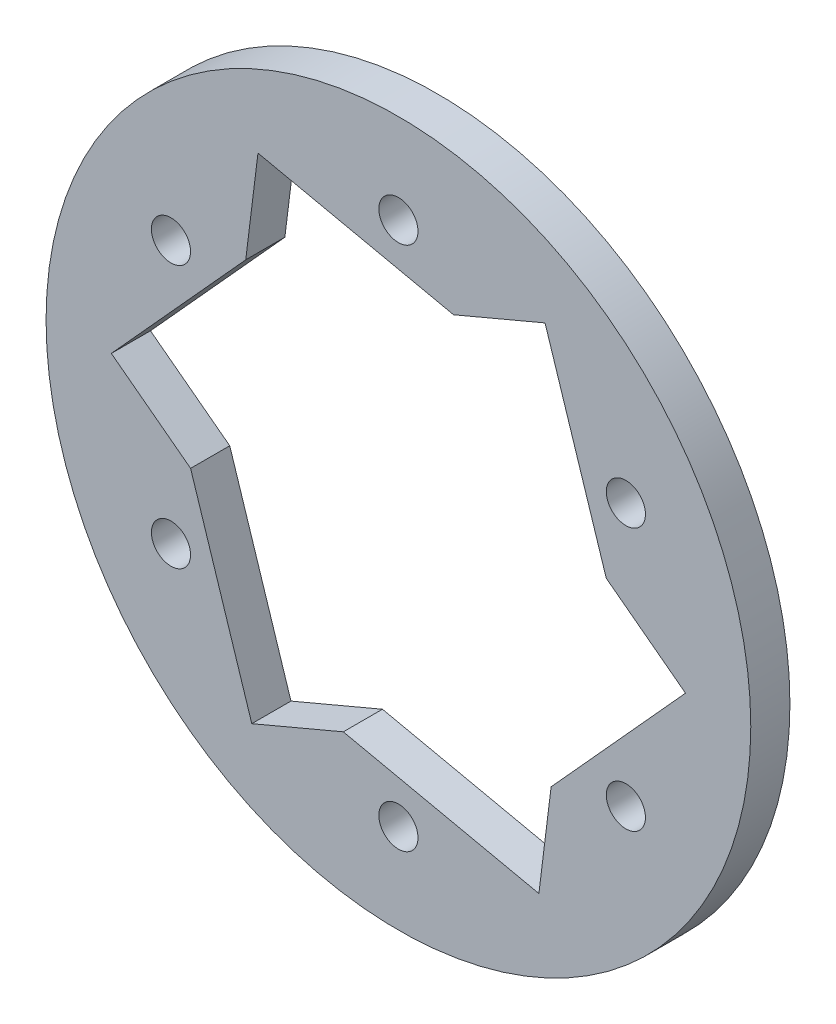
ISO-10303-21;
HEADER;
FILE_DESCRIPTION(('STEP AP214'),'2;1');
FILE_NAME('part.step','',(''),(''),'','','');
FILE_SCHEMA(('AUTOMOTIVE_DESIGN { 1 0 10303 214 1 1 1 1 }'));
ENDSEC;
DATA;
#1=APPLICATION_CONTEXT('core data for automotive mechanical design processes');
#2=APPLICATION_PROTOCOL_DEFINITION('international standard','automotive_design',2000,#1);
#3=PRODUCT_CONTEXT('',#1,'mechanical');
#4=PRODUCT('Part','Part','',(#3));
#5=PRODUCT_RELATED_PRODUCT_CATEGORY('part','',(#4));
#6=PRODUCT_DEFINITION_FORMATION('','',#4);
#7=PRODUCT_DEFINITION_CONTEXT('part definition',#1,'design');
#8=PRODUCT_DEFINITION('design','',#6,#7);
#9=PRODUCT_DEFINITION_SHAPE('','',#8);
#10=(LENGTH_UNIT() NAMED_UNIT(*) SI_UNIT(.MILLI.,.METRE.));
#11=(NAMED_UNIT(*) PLANE_ANGLE_UNIT() SI_UNIT($,.RADIAN.));
#12=(NAMED_UNIT(*) SI_UNIT($,.STERADIAN.) SOLID_ANGLE_UNIT());
#13=UNCERTAINTY_MEASURE_WITH_UNIT(LENGTH_MEASURE(1.E-05),#10,'distance_accuracy_value','');
#14=(GEOMETRIC_REPRESENTATION_CONTEXT(3) GLOBAL_UNCERTAINTY_ASSIGNED_CONTEXT((#13)) GLOBAL_UNIT_ASSIGNED_CONTEXT((#10,
#11,#12)) REPRESENTATION_CONTEXT('',''));
#15=CARTESIAN_POINT('',(0.,0.,0.));
#16=DIRECTION('',(0.,0.,1.));
#17=DIRECTION('',(1.,0.,0.));
#18=AXIS2_PLACEMENT_3D('',#15,#16,#17);
#19=CARTESIAN_POINT('',(158.4272777439,241.9520199932,3.));
#20=DIRECTION('',(0.,0.,1.));
#21=DIRECTION('',(1.,0.,0.));
#22=AXIS2_PLACEMENT_3D('',#19,#20,#21);
#23=PLANE('',#22);
#24=CARTESIAN_POINT('',(175.8557028019,252.014325892,3.));
#25=DIRECTION('',(0.,0.,1.));
#26=DIRECTION('',(1.,0.,0.));
#27=AXIS2_PLACEMENT_3D('',#24,#25,#26);
#28=CIRCLE('',#27,1.5);
#29=CARTESIAN_POINT('',(177.3557028019,252.014325892,3.));
#30=VERTEX_POINT('',#29);
#31=EDGE_CURVE('E215',#30,#30,#28,.T.);
#32=ORIENTED_EDGE('',*,*,#31,.F.);
#33=EDGE_LOOP('',(#32));
#34=FACE_BOUND('',#33,.T.);
#35=CARTESIAN_POINT('',(158.4272777439,221.8274081957,3.));
#36=DIRECTION('',(0.,0.,1.));
#37=DIRECTION('',(1.,0.,0.));
#38=AXIS2_PLACEMENT_3D('',#35,#36,#37);
#39=CIRCLE('',#38,1.5);
#40=CARTESIAN_POINT('',(159.9272777439,221.8274081957,3.));
#41=VERTEX_POINT('',#40);
#42=EDGE_CURVE('E227',#41,#41,#39,.T.);
#43=ORIENTED_EDGE('',*,*,#42,.F.);
#44=EDGE_LOOP('',(#43));
#45=FACE_BOUND('',#44,.T.);
#46=CARTESIAN_POINT('',(140.998852686,252.014325892,3.));
#47=DIRECTION('',(0.,0.,1.));
#48=DIRECTION('',(1.,0.,0.));
#49=AXIS2_PLACEMENT_3D('',#46,#47,#48);
#50=CIRCLE('',#49,1.5);
#51=CARTESIAN_POINT('',(142.498852686,252.014325892,3.));
#52=VERTEX_POINT('',#51);
#53=EDGE_CURVE('E239',#52,#52,#50,.T.);
#54=ORIENTED_EDGE('',*,*,#53,.F.);
#55=EDGE_LOOP('',(#54));
#56=FACE_BOUND('',#55,.T.);
#57=CARTESIAN_POINT('',(158.4272777439,241.9520199932,3.));
#58=DIRECTION('',(0.,0.,1.));
#59=DIRECTION('',(1.,0.,0.));
#60=AXIS2_PLACEMENT_3D('',#57,#58,#59);
#61=CIRCLE('',#60,27.);
#62=CARTESIAN_POINT('',(185.4272777439,241.9520199932,3.));
#63=VERTEX_POINT('',#62);
#64=EDGE_CURVE('E11',#63,#63,#61,.T.);
#65=ORIENTED_EDGE('',*,*,#64,.T.);
#66=EDGE_LOOP('',(#65));
#67=FACE_BOUND('',#66,.T.);
#68=CARTESIAN_POINT('',(158.4272777439,262.0766317907,3.));
#69=DIRECTION('',(0.,0.,1.));
#70=DIRECTION('',(1.,0.,0.));
#71=AXIS2_PLACEMENT_3D('',#68,#69,#70);
#72=CIRCLE('',#71,1.5);
#73=CARTESIAN_POINT('',(159.9272777439,262.0766317907,3.));
#74=VERTEX_POINT('',#73);
#75=EDGE_CURVE('E245',#74,#74,#72,.T.);
#76=ORIENTED_EDGE('',*,*,#75,.F.);
#77=EDGE_LOOP('',(#76));
#78=FACE_BOUND('',#77,.T.);
#79=CARTESIAN_POINT('',(140.998852686,231.8897140945,3.));
#80=DIRECTION('',(0.,0.,1.));
#81=DIRECTION('',(1.,0.,0.));
#82=AXIS2_PLACEMENT_3D('',#79,#80,#81);
#83=CIRCLE('',#82,1.5);
#84=CARTESIAN_POINT('',(142.498852686,231.8897140945,3.));
#85=VERTEX_POINT('',#84);
#86=EDGE_CURVE('E233',#85,#85,#83,.T.);
#87=ORIENTED_EDGE('',*,*,#86,.F.);
#88=EDGE_LOOP('',(#87));
#89=FACE_BOUND('',#88,.T.);
#90=CARTESIAN_POINT('',(175.8557028019,231.8897140945,3.));
#91=DIRECTION('',(0.,0.,1.));
#92=DIRECTION('',(1.,0.,0.));
#93=AXIS2_PLACEMENT_3D('',#90,#91,#92);
#94=CIRCLE('',#93,1.5);
#95=CARTESIAN_POINT('',(177.3557028019,231.8897140945,3.));
#96=VERTEX_POINT('',#95);
#97=EDGE_CURVE('E221',#96,#96,#94,.T.);
#98=ORIENTED_EDGE('',*,*,#97,.F.);
#99=EDGE_LOOP('',(#98));
#100=FACE_BOUND('',#99,.T.);
#101=DIRECTION('',(-0.921034791666512,-0.389480310850017,0.));
#102=VECTOR('',#101,1.);
#103=CARTESIAN_POINT('',(162.6518619415,257.9020321675,3.));
#104=LINE('',#103,#102);
#105=CARTESIAN_POINT('',(169.6626817403,260.8667152601,3.));
#106=VERTEX_POINT('',#105);
#107=CARTESIAN_POINT('',(162.6518619415,257.9020321675,3.));
#108=VERTEX_POINT('',#107);
#109=EDGE_CURVE('E130',#106,#108,#104,.T.);
#110=ORIENTED_EDGE('',*,*,#109,.F.);
#111=DIRECTION('',(-0.305873073601218,0.952072299169419,0.));
#112=VECTOR('',#111,1.);
#113=CARTESIAN_POINT('',(174.3526855762,246.2684288448,3.));
#114=LINE('',#113,#112);
#115=CARTESIAN_POINT('',(174.3526855762,246.2684288448,3.));
#116=VERTEX_POINT('',#115);
#117=EDGE_CURVE('E122',#116,#106,#114,.T.);
#118=ORIENTED_EDGE('',*,*,#117,.F.);
#119=DIRECTION('',(-0.797817239310822,0.602899371917453,0.));
#120=VECTOR('',#119,1.);
#121=CARTESIAN_POINT('',(174.3526855762,246.2684288448,3.));
#122=LINE('',#121,#120);
#123=CARTESIAN_POINT('',(180.4255863481,241.679222344,3.));
#124=VERTEX_POINT('',#123);
#125=EDGE_CURVE('E163',#124,#116,#122,.T.);
#126=ORIENTED_EDGE('',*,*,#125,.F.);
#127=DIRECTION('',(0.671582260518353,0.740930001658091,0.));
#128=VECTOR('',#127,1.);
#129=CARTESIAN_POINT('',(170.1281013787,230.3184166706,3.));
#130=LINE('',#129,#128);
#131=CARTESIAN_POINT('',(170.1281013787,230.3184166706,3.));
#132=VERTEX_POINT('',#131);
#133=EDGE_CURVE('E161',#132,#124,#130,.T.);
#134=ORIENTED_EDGE('',*,*,#133,.F.);
#135=DIRECTION('',(0.123217552356987,0.992379682778297,0.));
#136=VECTOR('',#135,1.);
#137=CARTESIAN_POINT('',(170.1281013787,230.3184166706,3.));
#138=LINE('',#137,#136);
#139=CARTESIAN_POINT('',(169.1901823517,222.7645270771,3.));
#140=VERTEX_POINT('',#139);
#141=EDGE_CURVE('E159',#140,#132,#138,.T.);
#142=ORIENTED_EDGE('',*,*,#141,.F.);
#143=DIRECTION('',(0.977455334120913,-0.211142297511831,0.));
#144=VECTOR('',#143,1.);
#145=CARTESIAN_POINT('',(154.2026935464,226.002007819,3.));
#146=LINE('',#145,#144);
#147=CARTESIAN_POINT('',(154.2026935464,226.002007819,3.));
#148=VERTEX_POINT('',#147);
#149=EDGE_CURVE('E157',#148,#140,#146,.T.);
#150=ORIENTED_EDGE('',*,*,#149,.F.);
#151=DIRECTION('',(0.921034791668505,0.389480310845304,0.));
#152=VECTOR('',#151,1.);
#153=CARTESIAN_POINT('',(154.2026935464,226.002007819,3.));
#154=LINE('',#153,#152);
#155=CARTESIAN_POINT('',(147.1918737475,223.0373247264,3.));
#156=VERTEX_POINT('',#155);
#157=EDGE_CURVE('E155',#156,#148,#154,.T.);
#158=ORIENTED_EDGE('',*,*,#157,.F.);
#159=DIRECTION('',(0.305873073603116,-0.952072299168809,0.));
#160=VECTOR('',#159,1.);
#161=CARTESIAN_POINT('',(142.5018699116,237.6356111416,3.));
#162=LINE('',#161,#160);
#163=CARTESIAN_POINT('',(142.5018699116,237.6356111416,3.));
#164=VERTEX_POINT('',#163);
#165=EDGE_CURVE('E153',#164,#156,#162,.T.);
#166=ORIENTED_EDGE('',*,*,#165,.F.);
#167=DIRECTION('',(0.797817239305675,-0.602899371924263,0.));
#168=VECTOR('',#167,1.);
#169=CARTESIAN_POINT('',(142.5018699116,237.6356111416,3.));
#170=LINE('',#169,#168);
#171=CARTESIAN_POINT('',(136.4272816388,242.2260928634,3.));
#172=VERTEX_POINT('',#171);
#173=EDGE_CURVE('E151',#172,#164,#170,.T.);
#174=ORIENTED_EDGE('',*,*,#173,.F.);
#175=DIRECTION('',(-0.671684054693982,-0.740837722223869,0.));
#176=VECTOR('',#175,1.);
#177=CARTESIAN_POINT('',(146.7264541091,253.5856233158,3.));
#178=LINE('',#177,#176);
#179=CARTESIAN_POINT('',(146.7264541091,253.5856233158,3.));
#180=VERTEX_POINT('',#179);
#181=EDGE_CURVE('E149',#180,#172,#178,.T.);
#182=ORIENTED_EDGE('',*,*,#181,.F.);
#183=DIRECTION('',(-0.123217552369929,-0.99237968277669,0.));
#184=VECTOR('',#183,1.);
#185=CARTESIAN_POINT('',(146.7264541091,253.5856233158,3.));
#186=LINE('',#185,#184);
#187=CARTESIAN_POINT('',(147.6643731362,261.1395129093,3.));
#188=VERTEX_POINT('',#187);
#189=EDGE_CURVE('E145',#188,#180,#186,.T.);
#190=ORIENTED_EDGE('',*,*,#189,.F.);
#191=DIRECTION('',(-0.977455334122259,0.211142297505598,0.));
#192=VECTOR('',#191,1.);
#193=CARTESIAN_POINT('',(162.6518619415,257.9020321675,3.));
#194=LINE('',#193,#192);
#195=EDGE_CURVE('E143',#108,#188,#194,.T.);
#196=ORIENTED_EDGE('',*,*,#195,.F.);
#197=EDGE_LOOP('',(#110,#118,#126,#134,#142,#150,#158,#166,#174,#182,#190,#196));
#198=FACE_BOUND('',#197,.T.);
#199=ADVANCED_FACE('F33',(#34,#45,#56,#67,#78,#89,#100,#198),#23,.T.);
#200=CARTESIAN_POINT('',(158.4272777439,241.9520199932,0.));
#201=DIRECTION('',(0.,0.,1.));
#202=DIRECTION('',(1.,0.,0.));
#203=AXIS2_PLACEMENT_3D('',#200,#201,#202);
#204=PLANE('',#203);
#205=CARTESIAN_POINT('',(175.8557028019,252.014325892,0.));
#206=DIRECTION('',(0.,0.,1.));
#207=DIRECTION('',(1.,0.,0.));
#208=AXIS2_PLACEMENT_3D('',#205,#206,#207);
#209=CIRCLE('',#208,1.5);
#210=CARTESIAN_POINT('',(177.3557028019,252.014325892,0.));
#211=VERTEX_POINT('',#210);
#212=EDGE_CURVE('E138',#211,#211,#209,.T.);
#213=ORIENTED_EDGE('',*,*,#212,.T.);
#214=EDGE_LOOP('',(#213));
#215=FACE_BOUND('',#214,.T.);
#216=CARTESIAN_POINT('',(158.4272777439,221.8274081957,0.));
#217=DIRECTION('',(0.,0.,1.));
#218=DIRECTION('',(1.,0.,0.));
#219=AXIS2_PLACEMENT_3D('',#216,#217,#218);
#220=CIRCLE('',#219,1.5);
#221=CARTESIAN_POINT('',(159.9272777439,221.8274081957,0.));
#222=VERTEX_POINT('',#221);
#223=EDGE_CURVE('E224',#222,#222,#220,.T.);
#224=ORIENTED_EDGE('',*,*,#223,.T.);
#225=EDGE_LOOP('',(#224));
#226=FACE_BOUND('',#225,.T.);
#227=CARTESIAN_POINT('',(140.998852686,252.014325892,0.));
#228=DIRECTION('',(0.,0.,1.));
#229=DIRECTION('',(1.,0.,0.));
#230=AXIS2_PLACEMENT_3D('',#227,#228,#229);
#231=CIRCLE('',#230,1.5);
#232=CARTESIAN_POINT('',(142.498852686,252.014325892,0.));
#233=VERTEX_POINT('',#232);
#234=EDGE_CURVE('E236',#233,#233,#231,.T.);
#235=ORIENTED_EDGE('',*,*,#234,.T.);
#236=EDGE_LOOP('',(#235));
#237=FACE_BOUND('',#236,.T.);
#238=CARTESIAN_POINT('',(158.4272777439,241.9520199932,0.));
#239=DIRECTION('',(0.,0.,1.));
#240=DIRECTION('',(1.,0.,0.));
#241=AXIS2_PLACEMENT_3D('',#238,#239,#240);
#242=CIRCLE('',#241,27.);
#243=CARTESIAN_POINT('',(185.4272777439,241.9520199932,0.));
#244=VERTEX_POINT('',#243);
#245=EDGE_CURVE('E37',#244,#244,#242,.T.);
#246=ORIENTED_EDGE('',*,*,#245,.F.);
#247=EDGE_LOOP('',(#246));
#248=FACE_BOUND('',#247,.T.);
#249=CARTESIAN_POINT('',(158.4272777439,262.0766317907,0.));
#250=DIRECTION('',(0.,0.,1.));
#251=DIRECTION('',(1.,0.,0.));
#252=AXIS2_PLACEMENT_3D('',#249,#250,#251);
#253=CIRCLE('',#252,1.5);
#254=CARTESIAN_POINT('',(159.9272777439,262.0766317907,0.));
#255=VERTEX_POINT('',#254);
#256=EDGE_CURVE('E242',#255,#255,#253,.T.);
#257=ORIENTED_EDGE('',*,*,#256,.T.);
#258=EDGE_LOOP('',(#257));
#259=FACE_BOUND('',#258,.T.);
#260=CARTESIAN_POINT('',(140.998852686,231.8897140945,0.));
#261=DIRECTION('',(0.,0.,1.));
#262=DIRECTION('',(1.,0.,0.));
#263=AXIS2_PLACEMENT_3D('',#260,#261,#262);
#264=CIRCLE('',#263,1.5);
#265=CARTESIAN_POINT('',(142.498852686,231.8897140945,0.));
#266=VERTEX_POINT('',#265);
#267=EDGE_CURVE('E230',#266,#266,#264,.T.);
#268=ORIENTED_EDGE('',*,*,#267,.T.);
#269=EDGE_LOOP('',(#268));
#270=FACE_BOUND('',#269,.T.);
#271=CARTESIAN_POINT('',(175.8557028019,231.8897140945,0.));
#272=DIRECTION('',(0.,0.,1.));
#273=DIRECTION('',(1.,0.,0.));
#274=AXIS2_PLACEMENT_3D('',#271,#272,#273);
#275=CIRCLE('',#274,1.5);
#276=CARTESIAN_POINT('',(177.3557028019,231.8897140945,0.));
#277=VERTEX_POINT('',#276);
#278=EDGE_CURVE('E218',#277,#277,#275,.T.);
#279=ORIENTED_EDGE('',*,*,#278,.T.);
#280=EDGE_LOOP('',(#279));
#281=FACE_BOUND('',#280,.T.);
#282=DIRECTION('',(-0.305873073601218,0.952072299169419,0.));
#283=VECTOR('',#282,1.);
#284=CARTESIAN_POINT('',(174.3526855762,246.2684288448,0.));
#285=LINE('',#284,#283);
#286=CARTESIAN_POINT('',(174.3526855762,246.2684288448,0.));
#287=VERTEX_POINT('',#286);
#288=CARTESIAN_POINT('',(169.6626817403,260.8667152601,0.));
#289=VERTEX_POINT('',#288);
#290=EDGE_CURVE('E56',#287,#289,#285,.T.);
#291=ORIENTED_EDGE('',*,*,#290,.T.);
#292=DIRECTION('',(-0.921034791666512,-0.389480310850017,0.));
#293=VECTOR('',#292,1.);
#294=CARTESIAN_POINT('',(162.6518619415,257.9020321675,0.));
#295=LINE('',#294,#293);
#296=CARTESIAN_POINT('',(162.6518619415,257.9020321675,0.));
#297=VERTEX_POINT('',#296);
#298=EDGE_CURVE('E137',#289,#297,#295,.T.);
#299=ORIENTED_EDGE('',*,*,#298,.T.);
#300=DIRECTION('',(-0.977455334122259,0.211142297505598,0.));
#301=VECTOR('',#300,1.);
#302=CARTESIAN_POINT('',(162.6518619415,257.9020321675,0.));
#303=LINE('',#302,#301);
#304=CARTESIAN_POINT('',(147.6643731362,261.1395129093,0.));
#305=VERTEX_POINT('',#304);
#306=EDGE_CURVE('E167',#297,#305,#303,.T.);
#307=ORIENTED_EDGE('',*,*,#306,.T.);
#308=DIRECTION('',(-0.123217552369929,-0.99237968277669,0.));
#309=VECTOR('',#308,1.);
#310=CARTESIAN_POINT('',(146.7264541091,253.5856233158,0.));
#311=LINE('',#310,#309);
#312=CARTESIAN_POINT('',(146.7264541091,253.5856233158,0.));
#313=VERTEX_POINT('',#312);
#314=EDGE_CURVE('E170',#305,#313,#311,.T.);
#315=ORIENTED_EDGE('',*,*,#314,.T.);
#316=DIRECTION('',(-0.671684054693982,-0.740837722223869,0.));
#317=VECTOR('',#316,1.);
#318=CARTESIAN_POINT('',(146.7264541091,253.5856233158,0.));
#319=LINE('',#318,#317);
#320=CARTESIAN_POINT('',(136.4272816388,242.2260928634,0.));
#321=VERTEX_POINT('',#320);
#322=EDGE_CURVE('E173',#313,#321,#319,.T.);
#323=ORIENTED_EDGE('',*,*,#322,.T.);
#324=DIRECTION('',(0.797817239305675,-0.602899371924263,0.));
#325=VECTOR('',#324,1.);
#326=CARTESIAN_POINT('',(142.5018699116,237.6356111416,0.));
#327=LINE('',#326,#325);
#328=CARTESIAN_POINT('',(142.5018699116,237.6356111416,0.));
#329=VERTEX_POINT('',#328);
#330=EDGE_CURVE('E176',#321,#329,#327,.T.);
#331=ORIENTED_EDGE('',*,*,#330,.T.);
#332=DIRECTION('',(0.305873073603116,-0.952072299168809,0.));
#333=VECTOR('',#332,1.);
#334=CARTESIAN_POINT('',(142.5018699116,237.6356111416,0.));
#335=LINE('',#334,#333);
#336=CARTESIAN_POINT('',(147.1918737475,223.0373247264,0.));
#337=VERTEX_POINT('',#336);
#338=EDGE_CURVE('E179',#329,#337,#335,.T.);
#339=ORIENTED_EDGE('',*,*,#338,.T.);
#340=DIRECTION('',(0.921034791668505,0.389480310845304,0.));
#341=VECTOR('',#340,1.);
#342=CARTESIAN_POINT('',(154.2026935464,226.002007819,0.));
#343=LINE('',#342,#341);
#344=CARTESIAN_POINT('',(154.2026935464,226.002007819,0.));
#345=VERTEX_POINT('',#344);
#346=EDGE_CURVE('E182',#337,#345,#343,.T.);
#347=ORIENTED_EDGE('',*,*,#346,.T.);
#348=DIRECTION('',(0.977455334120913,-0.211142297511831,0.));
#349=VECTOR('',#348,1.);
#350=CARTESIAN_POINT('',(154.2026935464,226.002007819,0.));
#351=LINE('',#350,#349);
#352=CARTESIAN_POINT('',(169.1901823517,222.7645270771,0.));
#353=VERTEX_POINT('',#352);
#354=EDGE_CURVE('E185',#345,#353,#351,.T.);
#355=ORIENTED_EDGE('',*,*,#354,.T.);
#356=DIRECTION('',(0.123217552356987,0.992379682778297,0.));
#357=VECTOR('',#356,1.);
#358=CARTESIAN_POINT('',(170.1281013787,230.3184166706,0.));
#359=LINE('',#358,#357);
#360=CARTESIAN_POINT('',(170.1281013787,230.3184166706,0.));
#361=VERTEX_POINT('',#360);
#362=EDGE_CURVE('E188',#353,#361,#359,.T.);
#363=ORIENTED_EDGE('',*,*,#362,.T.);
#364=DIRECTION('',(0.671582260518353,0.740930001658091,0.));
#365=VECTOR('',#364,1.);
#366=CARTESIAN_POINT('',(170.1281013787,230.3184166706,0.));
#367=LINE('',#366,#365);
#368=CARTESIAN_POINT('',(180.4255863481,241.679222344,0.));
#369=VERTEX_POINT('',#368);
#370=EDGE_CURVE('E191',#361,#369,#367,.T.);
#371=ORIENTED_EDGE('',*,*,#370,.T.);
#372=DIRECTION('',(-0.797817239310822,0.602899371917453,0.));
#373=VECTOR('',#372,1.);
#374=CARTESIAN_POINT('',(174.3526855762,246.2684288448,0.));
#375=LINE('',#374,#373);
#376=EDGE_CURVE('E131',#369,#287,#375,.T.);
#377=ORIENTED_EDGE('',*,*,#376,.T.);
#378=EDGE_LOOP('',(#291,#299,#307,#315,#323,#331,#339,#347,#355,#363,#371,#377));
#379=FACE_BOUND('',#378,.T.);
#380=ADVANCED_FACE('F251',(#215,#226,#237,#248,#259,#270,#281,#379),#204,.F.);
#381=CARTESIAN_POINT('',(158.4272777439,241.9520199932,3.));
#382=DIRECTION('',(0.,0.,-1.));
#383=DIRECTION('',(-1.,0.,0.));
#384=AXIS2_PLACEMENT_3D('',#381,#382,#383);
#385=CYLINDRICAL_SURFACE('',#384,27.);
#386=ORIENTED_EDGE('',*,*,#64,.F.);
#387=EDGE_LOOP('',(#386));
#388=FACE_BOUND('',#387,.T.);
#389=ORIENTED_EDGE('',*,*,#245,.T.);
#390=EDGE_LOOP('',(#389));
#391=FACE_BOUND('',#390,.T.);
#392=ADVANCED_FACE('F35',(#388,#391),#385,.T.);
#393=CARTESIAN_POINT('',(158.4272777439,262.0766317907,3.));
#394=DIRECTION('',(0.,0.,-1.));
#395=DIRECTION('',(-1.,0.,0.));
#396=AXIS2_PLACEMENT_3D('',#393,#394,#395);
#397=CYLINDRICAL_SURFACE('',#396,1.5);
#398=ORIENTED_EDGE('',*,*,#75,.T.);
#399=EDGE_LOOP('',(#398));
#400=FACE_BOUND('',#399,.T.);
#401=ORIENTED_EDGE('',*,*,#256,.F.);
#402=EDGE_LOOP('',(#401));
#403=FACE_BOUND('',#402,.T.);
#404=ADVANCED_FACE('F254',(#400,#403),#397,.F.);
#405=CARTESIAN_POINT('',(140.998852686,252.014325892,3.));
#406=DIRECTION('',(0.,0.,-1.));
#407=DIRECTION('',(-1.,0.,0.));
#408=AXIS2_PLACEMENT_3D('',#405,#406,#407);
#409=CYLINDRICAL_SURFACE('',#408,1.5);
#410=ORIENTED_EDGE('',*,*,#53,.T.);
#411=EDGE_LOOP('',(#410));
#412=FACE_BOUND('',#411,.T.);
#413=ORIENTED_EDGE('',*,*,#234,.F.);
#414=EDGE_LOOP('',(#413));
#415=FACE_BOUND('',#414,.T.);
#416=ADVANCED_FACE('F256',(#412,#415),#409,.F.);
#417=CARTESIAN_POINT('',(140.998852686,231.8897140945,3.));
#418=DIRECTION('',(0.,0.,-1.));
#419=DIRECTION('',(-1.,0.,0.));
#420=AXIS2_PLACEMENT_3D('',#417,#418,#419);
#421=CYLINDRICAL_SURFACE('',#420,1.5);
#422=ORIENTED_EDGE('',*,*,#86,.T.);
#423=EDGE_LOOP('',(#422));
#424=FACE_BOUND('',#423,.T.);
#425=ORIENTED_EDGE('',*,*,#267,.F.);
#426=EDGE_LOOP('',(#425));
#427=FACE_BOUND('',#426,.T.);
#428=ADVANCED_FACE('F263',(#424,#427),#421,.F.);
#429=CARTESIAN_POINT('',(158.4272777439,221.8274081957,3.));
#430=DIRECTION('',(0.,0.,-1.));
#431=DIRECTION('',(-1.,0.,0.));
#432=AXIS2_PLACEMENT_3D('',#429,#430,#431);
#433=CYLINDRICAL_SURFACE('',#432,1.5);
#434=ORIENTED_EDGE('',*,*,#42,.T.);
#435=EDGE_LOOP('',(#434));
#436=FACE_BOUND('',#435,.T.);
#437=ORIENTED_EDGE('',*,*,#223,.F.);
#438=EDGE_LOOP('',(#437));
#439=FACE_BOUND('',#438,.T.);
#440=ADVANCED_FACE('F292',(#436,#439),#433,.F.);
#441=CARTESIAN_POINT('',(175.8557028019,231.8897140945,3.));
#442=DIRECTION('',(0.,0.,-1.));
#443=DIRECTION('',(-1.,0.,0.));
#444=AXIS2_PLACEMENT_3D('',#441,#442,#443);
#445=CYLINDRICAL_SURFACE('',#444,1.5);
#446=ORIENTED_EDGE('',*,*,#97,.T.);
#447=EDGE_LOOP('',(#446));
#448=FACE_BOUND('',#447,.T.);
#449=ORIENTED_EDGE('',*,*,#278,.F.);
#450=EDGE_LOOP('',(#449));
#451=FACE_BOUND('',#450,.T.);
#452=ADVANCED_FACE('F288',(#448,#451),#445,.F.);
#453=CARTESIAN_POINT('',(175.8557028019,252.014325892,3.));
#454=DIRECTION('',(0.,0.,-1.));
#455=DIRECTION('',(-1.,0.,0.));
#456=AXIS2_PLACEMENT_3D('',#453,#454,#455);
#457=CYLINDRICAL_SURFACE('',#456,1.5);
#458=ORIENTED_EDGE('',*,*,#31,.T.);
#459=EDGE_LOOP('',(#458));
#460=FACE_BOUND('',#459,.T.);
#461=ORIENTED_EDGE('',*,*,#212,.F.);
#462=EDGE_LOOP('',(#461));
#463=FACE_BOUND('',#462,.T.);
#464=ADVANCED_FACE('F291',(#460,#463),#457,.F.);
#465=CARTESIAN_POINT('',(174.3526855762,246.2684288448,3.));
#466=DIRECTION('',(-0.952072299169419,-0.305873073601218,0.));
#467=DIRECTION('',(0.305873073601218,-0.952072299169419,0.));
#468=AXIS2_PLACEMENT_3D('',#465,#466,#467);
#469=PLANE('',#468);
#470=ORIENTED_EDGE('',*,*,#290,.F.);
#471=DIRECTION('',(0.,0.,-1.));
#472=VECTOR('',#471,1.);
#473=CARTESIAN_POINT('',(174.3526855762,246.2684288448,3.));
#474=LINE('',#473,#472);
#475=EDGE_CURVE('E126',#116,#287,#474,.T.);
#476=ORIENTED_EDGE('',*,*,#475,.F.);
#477=ORIENTED_EDGE('',*,*,#117,.T.);
#478=DIRECTION('',(0.,0.,-1.));
#479=VECTOR('',#478,1.);
#480=CARTESIAN_POINT('',(169.6626817403,260.8667152601,3.));
#481=LINE('',#480,#479);
#482=EDGE_CURVE('E125',#106,#289,#481,.T.);
#483=ORIENTED_EDGE('',*,*,#482,.T.);
#484=EDGE_LOOP('',(#470,#476,#477,#483));
#485=FACE_BOUND('',#484,.T.);
#486=ADVANCED_FACE('F124',(#485),#469,.T.);
#487=CARTESIAN_POINT('',(162.6518619415,257.9020321675,3.));
#488=DIRECTION('',(0.389480310850017,-0.921034791666511,0.));
#489=DIRECTION('',(0.921034791666512,0.389480310850017,0.));
#490=AXIS2_PLACEMENT_3D('',#487,#488,#489);
#491=PLANE('',#490);
#492=ORIENTED_EDGE('',*,*,#298,.F.);
#493=ORIENTED_EDGE('',*,*,#482,.F.);
#494=ORIENTED_EDGE('',*,*,#109,.T.);
#495=DIRECTION('',(0.,0.,-1.));
#496=VECTOR('',#495,1.);
#497=CARTESIAN_POINT('',(162.6518619415,257.9020321675,3.));
#498=LINE('',#497,#496);
#499=EDGE_CURVE('E139',#108,#297,#498,.T.);
#500=ORIENTED_EDGE('',*,*,#499,.T.);
#501=EDGE_LOOP('',(#492,#493,#494,#500));
#502=FACE_BOUND('',#501,.T.);
#503=ADVANCED_FACE('F134',(#502),#491,.T.);
#504=CARTESIAN_POINT('',(162.6518619415,257.9020321675,3.));
#505=DIRECTION('',(-0.211142297505598,-0.977455334122259,0.));
#506=DIRECTION('',(0.977455334122259,-0.211142297505598,0.));
#507=AXIS2_PLACEMENT_3D('',#504,#505,#506);
#508=PLANE('',#507);
#509=ORIENTED_EDGE('',*,*,#306,.F.);
#510=ORIENTED_EDGE('',*,*,#499,.F.);
#511=ORIENTED_EDGE('',*,*,#195,.T.);
#512=DIRECTION('',(0.,0.,-1.));
#513=VECTOR('',#512,1.);
#514=CARTESIAN_POINT('',(147.6643731362,261.1395129093,3.));
#515=LINE('',#514,#513);
#516=EDGE_CURVE('E212',#188,#305,#515,.T.);
#517=ORIENTED_EDGE('',*,*,#516,.T.);
#518=EDGE_LOOP('',(#509,#510,#511,#517));
#519=FACE_BOUND('',#518,.T.);
#520=ADVANCED_FACE('F339',(#519),#508,.T.);
#521=CARTESIAN_POINT('',(146.7264541091,253.5856233158,3.));
#522=DIRECTION('',(0.99237968277669,-0.123217552369929,0.));
#523=DIRECTION('',(0.123217552369929,0.99237968277669,0.));
#524=AXIS2_PLACEMENT_3D('',#521,#522,#523);
#525=PLANE('',#524);
#526=ORIENTED_EDGE('',*,*,#314,.F.);
#527=ORIENTED_EDGE('',*,*,#516,.F.);
#528=ORIENTED_EDGE('',*,*,#189,.T.);
#529=DIRECTION('',(0.,0.,-1.));
#530=VECTOR('',#529,1.);
#531=CARTESIAN_POINT('',(146.7264541091,253.5856233158,3.));
#532=LINE('',#531,#530);
#533=EDGE_CURVE('E210',#180,#313,#532,.T.);
#534=ORIENTED_EDGE('',*,*,#533,.T.);
#535=EDGE_LOOP('',(#526,#527,#528,#534));
#536=FACE_BOUND('',#535,.T.);
#537=ADVANCED_FACE('F335',(#536),#525,.T.);
#538=CARTESIAN_POINT('',(146.7264541091,253.5856233158,3.));
#539=DIRECTION('',(0.74083772222387,-0.671684054693982,0.));
#540=DIRECTION('',(0.671684054693982,0.74083772222387,0.));
#541=AXIS2_PLACEMENT_3D('',#538,#539,#540);
#542=PLANE('',#541);
#543=ORIENTED_EDGE('',*,*,#322,.F.);
#544=ORIENTED_EDGE('',*,*,#533,.F.);
#545=ORIENTED_EDGE('',*,*,#181,.T.);
#546=DIRECTION('',(0.,0.,-1.));
#547=VECTOR('',#546,1.);
#548=CARTESIAN_POINT('',(136.4272816388,242.2260928634,3.));
#549=LINE('',#548,#547);
#550=EDGE_CURVE('E208',#172,#321,#549,.T.);
#551=ORIENTED_EDGE('',*,*,#550,.T.);
#552=EDGE_LOOP('',(#543,#544,#545,#551));
#553=FACE_BOUND('',#552,.T.);
#554=ADVANCED_FACE('F332',(#553),#542,.T.);
#555=CARTESIAN_POINT('',(142.5018699116,237.6356111416,3.));
#556=DIRECTION('',(0.602899371924263,0.797817239305675,0.));
#557=DIRECTION('',(-0.797817239305675,0.602899371924263,0.));
#558=AXIS2_PLACEMENT_3D('',#555,#556,#557);
#559=PLANE('',#558);
#560=ORIENTED_EDGE('',*,*,#330,.F.);
#561=ORIENTED_EDGE('',*,*,#550,.F.);
#562=ORIENTED_EDGE('',*,*,#173,.T.);
#563=DIRECTION('',(0.,0.,-1.));
#564=VECTOR('',#563,1.);
#565=CARTESIAN_POINT('',(142.5018699116,237.6356111416,3.));
#566=LINE('',#565,#564);
#567=EDGE_CURVE('E206',#164,#329,#566,.T.);
#568=ORIENTED_EDGE('',*,*,#567,.T.);
#569=EDGE_LOOP('',(#560,#561,#562,#568));
#570=FACE_BOUND('',#569,.T.);
#571=ADVANCED_FACE('F326',(#570),#559,.T.);
#572=CARTESIAN_POINT('',(142.5018699116,237.6356111416,3.));
#573=DIRECTION('',(0.952072299168809,0.305873073603116,0.));
#574=DIRECTION('',(-0.305873073603116,0.95207229916881,0.));
#575=AXIS2_PLACEMENT_3D('',#572,#573,#574);
#576=PLANE('',#575);
#577=ORIENTED_EDGE('',*,*,#338,.F.);
#578=ORIENTED_EDGE('',*,*,#567,.F.);
#579=ORIENTED_EDGE('',*,*,#165,.T.);
#580=DIRECTION('',(0.,0.,-1.));
#581=VECTOR('',#580,1.);
#582=CARTESIAN_POINT('',(147.1918737475,223.0373247264,3.));
#583=LINE('',#582,#581);
#584=EDGE_CURVE('E204',#156,#337,#583,.T.);
#585=ORIENTED_EDGE('',*,*,#584,.T.);
#586=EDGE_LOOP('',(#577,#578,#579,#585));
#587=FACE_BOUND('',#586,.T.);
#588=ADVANCED_FACE('F322',(#587),#576,.T.);
#589=CARTESIAN_POINT('',(154.2026935464,226.002007819,3.));
#590=DIRECTION('',(-0.389480310845304,0.921034791668504,0.));
#591=DIRECTION('',(-0.921034791668505,-0.389480310845304,0.));
#592=AXIS2_PLACEMENT_3D('',#589,#590,#591);
#593=PLANE('',#592);
#594=ORIENTED_EDGE('',*,*,#346,.F.);
#595=ORIENTED_EDGE('',*,*,#584,.F.);
#596=ORIENTED_EDGE('',*,*,#157,.T.);
#597=DIRECTION('',(0.,0.,-1.));
#598=VECTOR('',#597,1.);
#599=CARTESIAN_POINT('',(154.2026935464,226.002007819,3.));
#600=LINE('',#599,#598);
#601=EDGE_CURVE('E202',#148,#345,#600,.T.);
#602=ORIENTED_EDGE('',*,*,#601,.T.);
#603=EDGE_LOOP('',(#594,#595,#596,#602));
#604=FACE_BOUND('',#603,.T.);
#605=ADVANCED_FACE('F319',(#604),#593,.T.);
#606=CARTESIAN_POINT('',(154.2026935464,226.002007819,3.));
#607=DIRECTION('',(0.211142297511831,0.977455334120913,0.));
#608=DIRECTION('',(-0.977455334120913,0.211142297511831,0.));
#609=AXIS2_PLACEMENT_3D('',#606,#607,#608);
#610=PLANE('',#609);
#611=ORIENTED_EDGE('',*,*,#354,.F.);
#612=ORIENTED_EDGE('',*,*,#601,.F.);
#613=ORIENTED_EDGE('',*,*,#149,.T.);
#614=DIRECTION('',(0.,0.,-1.));
#615=VECTOR('',#614,1.);
#616=CARTESIAN_POINT('',(169.1901823517,222.7645270771,3.));
#617=LINE('',#616,#615);
#618=EDGE_CURVE('E200',#140,#353,#617,.T.);
#619=ORIENTED_EDGE('',*,*,#618,.T.);
#620=EDGE_LOOP('',(#611,#612,#613,#619));
#621=FACE_BOUND('',#620,.T.);
#622=ADVANCED_FACE('F311',(#621),#610,.T.);
#623=CARTESIAN_POINT('',(170.1281013787,230.3184166706,3.));
#624=DIRECTION('',(-0.992379682778297,0.123217552356987,0.));
#625=DIRECTION('',(-0.123217552356987,-0.992379682778297,0.));
#626=AXIS2_PLACEMENT_3D('',#623,#624,#625);
#627=PLANE('',#626);
#628=ORIENTED_EDGE('',*,*,#362,.F.);
#629=ORIENTED_EDGE('',*,*,#618,.F.);
#630=ORIENTED_EDGE('',*,*,#141,.T.);
#631=DIRECTION('',(0.,0.,-1.));
#632=VECTOR('',#631,1.);
#633=CARTESIAN_POINT('',(170.1281013787,230.3184166706,3.));
#634=LINE('',#633,#632);
#635=EDGE_CURVE('E198',#132,#361,#634,.T.);
#636=ORIENTED_EDGE('',*,*,#635,.T.);
#637=EDGE_LOOP('',(#628,#629,#630,#636));
#638=FACE_BOUND('',#637,.T.);
#639=ADVANCED_FACE('F307',(#638),#627,.T.);
#640=CARTESIAN_POINT('',(170.1281013787,230.3184166706,3.));
#641=DIRECTION('',(-0.740930001658091,0.671582260518353,0.));
#642=DIRECTION('',(-0.671582260518353,-0.740930001658091,0.));
#643=AXIS2_PLACEMENT_3D('',#640,#641,#642);
#644=PLANE('',#643);
#645=ORIENTED_EDGE('',*,*,#370,.F.);
#646=ORIENTED_EDGE('',*,*,#635,.F.);
#647=ORIENTED_EDGE('',*,*,#133,.T.);
#648=DIRECTION('',(0.,0.,-1.));
#649=VECTOR('',#648,1.);
#650=CARTESIAN_POINT('',(180.4255863481,241.679222344,3.));
#651=LINE('',#650,#649);
#652=EDGE_CURVE('E48',#124,#369,#651,.T.);
#653=ORIENTED_EDGE('',*,*,#652,.T.);
#654=EDGE_LOOP('',(#645,#646,#647,#653));
#655=FACE_BOUND('',#654,.T.);
#656=ADVANCED_FACE('F304',(#655),#644,.T.);
#657=CARTESIAN_POINT('',(174.3526855762,246.2684288448,3.));
#658=DIRECTION('',(-0.602899371917453,-0.797817239310822,0.));
#659=DIRECTION('',(0.797817239310822,-0.602899371917453,0.));
#660=AXIS2_PLACEMENT_3D('',#657,#658,#659);
#661=PLANE('',#660);
#662=ORIENTED_EDGE('',*,*,#376,.F.);
#663=ORIENTED_EDGE('',*,*,#652,.F.);
#664=ORIENTED_EDGE('',*,*,#125,.T.);
#665=ORIENTED_EDGE('',*,*,#475,.T.);
#666=EDGE_LOOP('',(#662,#663,#664,#665));
#667=FACE_BOUND('',#666,.T.);
#668=ADVANCED_FACE('F298',(#667),#661,.T.);
#669=CLOSED_SHELL('',(#199,#380,#392,#404,#416,#428,#440,#452,#464,#486,#503,#520,#537,#554,
#571,#588,#605,#622,#639,#656,#668));
#670=MANIFOLD_SOLID_BREP('B2',#669);
#671=ADVANCED_BREP_SHAPE_REPRESENTATION('',(#18,#670),#14);
#672=SHAPE_DEFINITION_REPRESENTATION(#9,#671);
ENDSEC;
END-ISO-10303-21;
